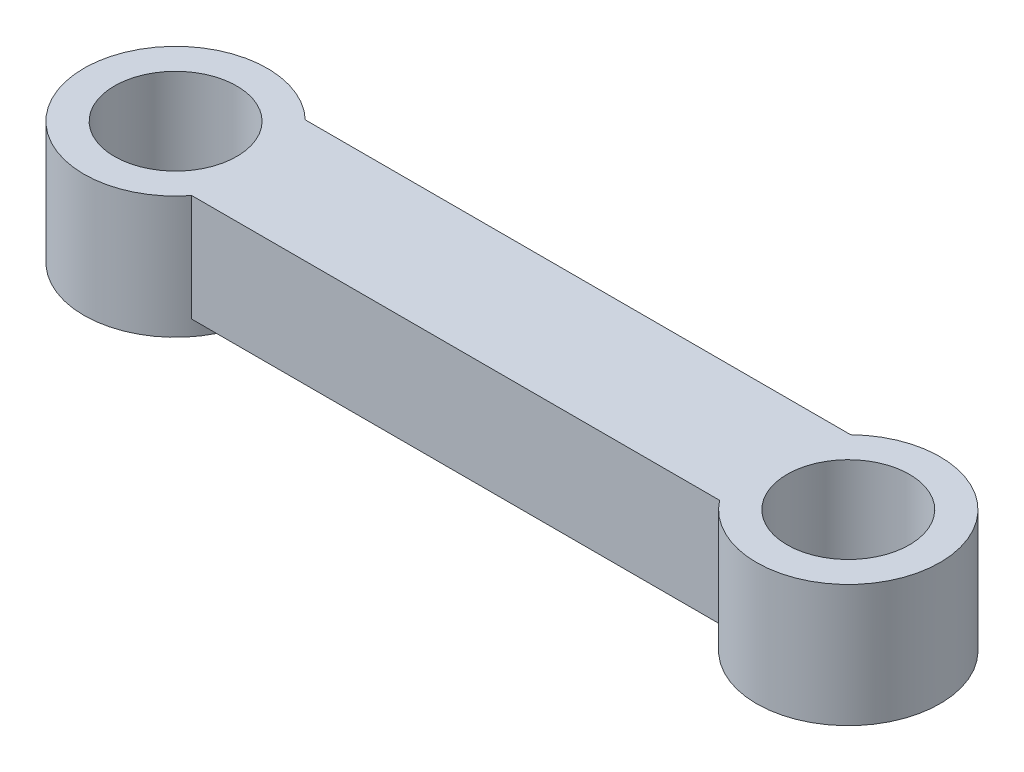
ISO-10303-21;
HEADER;
FILE_DESCRIPTION(('STEP AP214'),'2;1');
FILE_NAME('part.step','',(''),(''),'','','');
FILE_SCHEMA(('AUTOMOTIVE_DESIGN { 1 0 10303 214 1 1 1 1 }'));
ENDSEC;
DATA;
#1=APPLICATION_CONTEXT('core data for automotive mechanical design processes');
#2=APPLICATION_PROTOCOL_DEFINITION('international standard','automotive_design',2000,#1);
#3=PRODUCT_CONTEXT('',#1,'mechanical');
#4=PRODUCT('Part','Part','',(#3));
#5=PRODUCT_RELATED_PRODUCT_CATEGORY('part','',(#4));
#6=PRODUCT_DEFINITION_FORMATION('','',#4);
#7=PRODUCT_DEFINITION_CONTEXT('part definition',#1,'design');
#8=PRODUCT_DEFINITION('design','',#6,#7);
#9=PRODUCT_DEFINITION_SHAPE('','',#8);
#10=(LENGTH_UNIT() NAMED_UNIT(*) SI_UNIT(.MILLI.,.METRE.));
#11=(NAMED_UNIT(*) PLANE_ANGLE_UNIT() SI_UNIT($,.RADIAN.));
#12=(NAMED_UNIT(*) SI_UNIT($,.STERADIAN.) SOLID_ANGLE_UNIT());
#13=UNCERTAINTY_MEASURE_WITH_UNIT(LENGTH_MEASURE(1.E-05),#10,'distance_accuracy_value','');
#14=(GEOMETRIC_REPRESENTATION_CONTEXT(3) GLOBAL_UNCERTAINTY_ASSIGNED_CONTEXT((#13)) GLOBAL_UNIT_ASSIGNED_CONTEXT((#10,
#11,#12)) REPRESENTATION_CONTEXT('',''));
#15=CARTESIAN_POINT('',(0.,0.,0.));
#16=DIRECTION('',(0.,0.,1.));
#17=DIRECTION('',(1.,0.,0.));
#18=AXIS2_PLACEMENT_3D('',#15,#16,#17);
#19=CARTESIAN_POINT('',(0.,3.5,0.));
#20=DIRECTION('',(0.,0.,-1.));
#21=DIRECTION('',(-1.,0.,0.));
#22=AXIS2_PLACEMENT_3D('',#19,#20,#21);
#23=PLANE('',#22);
#24=DIRECTION('',(1.,0.,0.));
#25=VECTOR('',#24,1.);
#26=CARTESIAN_POINT('',(0.,0.,0.));
#27=LINE('',#26,#25);
#28=CARTESIAN_POINT('',(5.36894795532949,0.,0.));
#29=VERTEX_POINT('',#28);
#30=CARTESIAN_POINT('',(22.6310520446705,0.,0.));
#31=VERTEX_POINT('',#30);
#32=EDGE_CURVE('E98',#29,#31,#27,.T.);
#33=ORIENTED_EDGE('',*,*,#32,.T.);
#34=DIRECTION('',(0.,1.,0.));
#35=VECTOR('',#34,1.);
#36=CARTESIAN_POINT('',(22.6310520446705,-0.5,0.));
#37=LINE('',#36,#35);
#38=CARTESIAN_POINT('',(22.6310520446705,3.5,0.));
#39=VERTEX_POINT('',#38);
#40=EDGE_CURVE('E113',#31,#39,#37,.T.);
#41=ORIENTED_EDGE('',*,*,#40,.T.);
#42=DIRECTION('',(1.,0.,0.));
#43=VECTOR('',#42,1.);
#44=CARTESIAN_POINT('',(0.,3.5,0.));
#45=LINE('',#44,#43);
#46=CARTESIAN_POINT('',(5.36894795532949,3.5,0.));
#47=VERTEX_POINT('',#46);
#48=EDGE_CURVE('E55',#47,#39,#45,.T.);
#49=ORIENTED_EDGE('',*,*,#48,.F.);
#50=DIRECTION('',(0.,1.,0.));
#51=VECTOR('',#50,1.);
#52=CARTESIAN_POINT('',(5.36894795532949,-0.5,0.));
#53=LINE('',#52,#51);
#54=EDGE_CURVE('E100',#47,#29,#53,.F.);
#55=ORIENTED_EDGE('',*,*,#54,.T.);
#56=EDGE_LOOP('',(#33,#41,#49,#55));
#57=FACE_BOUND('',#56,.T.);
#58=ADVANCED_FACE('F33',(#57),#23,.F.);
#59=CARTESIAN_POINT('',(0.,3.5,-4.));
#60=DIRECTION('',(0.,0.,1.));
#61=DIRECTION('',(1.,0.,0.));
#62=AXIS2_PLACEMENT_3D('',#59,#60,#61);
#63=PLANE('',#62);
#64=DIRECTION('',(-1.,0.,0.));
#65=VECTOR('',#64,1.);
#66=CARTESIAN_POINT('',(0.,3.5,-4.));
#67=LINE('',#66,#65);
#68=CARTESIAN_POINT('',(22.9173774059633,3.5,-4.));
#69=VERTEX_POINT('',#68);
#70=CARTESIAN_POINT('',(5.08262259403675,3.5,-4.));
#71=VERTEX_POINT('',#70);
#72=EDGE_CURVE('E40',#69,#71,#67,.T.);
#73=ORIENTED_EDGE('',*,*,#72,.F.);
#74=DIRECTION('',(0.,1.,0.));
#75=VECTOR('',#74,1.);
#76=CARTESIAN_POINT('',(22.9173774059633,-0.5,-4.));
#77=LINE('',#76,#75);
#78=CARTESIAN_POINT('',(22.9173774059633,0.,-4.));
#79=VERTEX_POINT('',#78);
#80=EDGE_CURVE('E74',#69,#79,#77,.F.);
#81=ORIENTED_EDGE('',*,*,#80,.T.);
#82=DIRECTION('',(-1.,0.,0.));
#83=VECTOR('',#82,1.);
#84=CARTESIAN_POINT('',(0.,0.,-4.));
#85=LINE('',#84,#83);
#86=CARTESIAN_POINT('',(5.08262259403675,0.,-4.));
#87=VERTEX_POINT('',#86);
#88=EDGE_CURVE('E94',#79,#87,#85,.T.);
#89=ORIENTED_EDGE('',*,*,#88,.T.);
#90=DIRECTION('',(0.,1.,0.));
#91=VECTOR('',#90,1.);
#92=CARTESIAN_POINT('',(5.08262259403675,-0.5,-4.));
#93=LINE('',#92,#91);
#94=EDGE_CURVE('E92',#87,#71,#93,.T.);
#95=ORIENTED_EDGE('',*,*,#94,.T.);
#96=EDGE_LOOP('',(#73,#81,#89,#95));
#97=FACE_BOUND('',#96,.T.);
#98=ADVANCED_FACE('F91',(#97),#63,.F.);
#99=CARTESIAN_POINT('',(0.,0.,0.));
#100=DIRECTION('',(0.,-1.,0.));
#101=DIRECTION('',(0.,0.,-1.));
#102=AXIS2_PLACEMENT_3D('',#99,#100,#101);
#103=PLANE('',#102);
#104=CARTESIAN_POINT('',(25.,0.,-1.84067530676657));
#105=DIRECTION('',(0.,-1.,0.));
#106=DIRECTION('',(0.,0.,-1.));
#107=AXIS2_PLACEMENT_3D('',#104,#105,#106);
#108=CIRCLE('',#107,3.);
#109=EDGE_CURVE('E80',#31,#79,#108,.T.);
#110=ORIENTED_EDGE('',*,*,#109,.F.);
#111=ORIENTED_EDGE('',*,*,#32,.F.);
#112=CARTESIAN_POINT('',(3.,0.,-1.84067530676657));
#113=DIRECTION('',(0.,-1.,0.));
#114=DIRECTION('',(0.,0.,-1.));
#115=AXIS2_PLACEMENT_3D('',#112,#113,#114);
#116=CIRCLE('',#115,3.);
#117=EDGE_CURVE('E11',#87,#29,#116,.T.);
#118=ORIENTED_EDGE('',*,*,#117,.F.);
#119=ORIENTED_EDGE('',*,*,#88,.F.);
#120=EDGE_LOOP('',(#110,#111,#118,#119));
#121=FACE_BOUND('',#120,.T.);
#122=ADVANCED_FACE('F104',(#121),#103,.T.);
#123=CARTESIAN_POINT('',(0.,3.5,0.));
#124=DIRECTION('',(0.,-1.,0.));
#125=DIRECTION('',(0.,0.,-1.));
#126=AXIS2_PLACEMENT_3D('',#123,#124,#125);
#127=PLANE('',#126);
#128=CARTESIAN_POINT('',(3.,3.5,-1.84067530676657));
#129=DIRECTION('',(0.,1.,0.));
#130=DIRECTION('',(0.,0.,1.));
#131=AXIS2_PLACEMENT_3D('',#128,#129,#130);
#132=CIRCLE('',#131,2.);
#133=CARTESIAN_POINT('',(3.,3.5,0.15932469323343));
#134=VERTEX_POINT('',#133);
#135=EDGE_CURVE('E124',#134,#134,#132,.T.);
#136=ORIENTED_EDGE('',*,*,#135,.F.);
#137=EDGE_LOOP('',(#136));
#138=FACE_BOUND('',#137,.T.);
#139=CARTESIAN_POINT('',(25.,3.5,-1.84067530676657));
#140=DIRECTION('',(0.,1.,0.));
#141=DIRECTION('',(0.,0.,1.));
#142=AXIS2_PLACEMENT_3D('',#139,#140,#141);
#143=CIRCLE('',#142,2.);
#144=CARTESIAN_POINT('',(25.,3.5,0.159324693233433));
#145=VERTEX_POINT('',#144);
#146=EDGE_CURVE('E118',#145,#145,#143,.T.);
#147=ORIENTED_EDGE('',*,*,#146,.F.);
#148=EDGE_LOOP('',(#147));
#149=FACE_BOUND('',#148,.T.);
#150=ORIENTED_EDGE('',*,*,#48,.T.);
#151=CARTESIAN_POINT('',(25.,3.5,-1.84067530676657));
#152=DIRECTION('',(0.,1.,0.));
#153=DIRECTION('',(0.,0.,1.));
#154=AXIS2_PLACEMENT_3D('',#151,#152,#153);
#155=CIRCLE('',#154,3.);
#156=EDGE_CURVE('E78',#39,#69,#155,.T.);
#157=ORIENTED_EDGE('',*,*,#156,.T.);
#158=ORIENTED_EDGE('',*,*,#72,.T.);
#159=CARTESIAN_POINT('',(3.,3.5,-1.84067530676657));
#160=DIRECTION('',(0.,1.,0.));
#161=DIRECTION('',(0.,0.,1.));
#162=AXIS2_PLACEMENT_3D('',#159,#160,#161);
#163=CIRCLE('',#162,3.);
#164=EDGE_CURVE('E47',#71,#47,#163,.T.);
#165=ORIENTED_EDGE('',*,*,#164,.T.);
#166=EDGE_LOOP('',(#150,#157,#158,#165));
#167=FACE_BOUND('',#166,.T.);
#168=ADVANCED_FACE('F86',(#138,#149,#167),#127,.F.);
#169=CARTESIAN_POINT('',(3.,-0.5,-1.84067530676657));
#170=DIRECTION('',(0.,1.,0.));
#171=DIRECTION('',(0.,0.,1.));
#172=AXIS2_PLACEMENT_3D('',#169,#170,#171);
#173=CYLINDRICAL_SURFACE('',#172,3.);
#174=ORIENTED_EDGE('',*,*,#164,.F.);
#175=ORIENTED_EDGE('',*,*,#94,.F.);
#176=ORIENTED_EDGE('',*,*,#117,.T.);
#177=ORIENTED_EDGE('',*,*,#54,.F.);
#178=EDGE_LOOP('',(#174,#175,#176,#177));
#179=FACE_BOUND('',#178,.T.);
#180=CARTESIAN_POINT('',(3.,-0.5,-1.84067530676657));
#181=DIRECTION('',(0.,1.,0.));
#182=DIRECTION('',(0.,0.,1.));
#183=AXIS2_PLACEMENT_3D('',#180,#181,#182);
#184=CIRCLE('',#183,3.);
#185=CARTESIAN_POINT('',(3.,-0.5,1.15932469323343));
#186=VERTEX_POINT('',#185);
#187=EDGE_CURVE('E107',#186,#186,#184,.T.);
#188=ORIENTED_EDGE('',*,*,#187,.T.);
#189=EDGE_LOOP('',(#188));
#190=FACE_BOUND('',#189,.T.);
#191=ADVANCED_FACE('F105',(#179,#190),#173,.T.);
#192=CARTESIAN_POINT('',(3.,-0.5,-1.84067530676657));
#193=DIRECTION('',(0.,1.,0.));
#194=DIRECTION('',(0.,0.,1.));
#195=AXIS2_PLACEMENT_3D('',#192,#193,#194);
#196=PLANE('',#195);
#197=CARTESIAN_POINT('',(3.,-0.5,-1.84067530676657));
#198=DIRECTION('',(0.,1.,0.));
#199=DIRECTION('',(0.,0.,1.));
#200=AXIS2_PLACEMENT_3D('',#197,#198,#199);
#201=CIRCLE('',#200,2.);
#202=CARTESIAN_POINT('',(3.,-0.5,0.15932469323343));
#203=VERTEX_POINT('',#202);
#204=EDGE_CURVE('E89',#203,#203,#201,.T.);
#205=ORIENTED_EDGE('',*,*,#204,.T.);
#206=EDGE_LOOP('',(#205));
#207=FACE_BOUND('',#206,.T.);
#208=ORIENTED_EDGE('',*,*,#187,.F.);
#209=EDGE_LOOP('',(#208));
#210=FACE_BOUND('',#209,.T.);
#211=ADVANCED_FACE('F130',(#207,#210),#196,.F.);
#212=CARTESIAN_POINT('',(25.,-0.5,-1.84067530676657));
#213=DIRECTION('',(0.,1.,0.));
#214=DIRECTION('',(0.,0.,1.));
#215=AXIS2_PLACEMENT_3D('',#212,#213,#214);
#216=CYLINDRICAL_SURFACE('',#215,3.);
#217=ORIENTED_EDGE('',*,*,#156,.F.);
#218=ORIENTED_EDGE('',*,*,#40,.F.);
#219=ORIENTED_EDGE('',*,*,#109,.T.);
#220=ORIENTED_EDGE('',*,*,#80,.F.);
#221=EDGE_LOOP('',(#217,#218,#219,#220));
#222=FACE_BOUND('',#221,.T.);
#223=CARTESIAN_POINT('',(25.,-0.5,-1.84067530676657));
#224=DIRECTION('',(0.,1.,0.));
#225=DIRECTION('',(0.,0.,1.));
#226=AXIS2_PLACEMENT_3D('',#223,#224,#225);
#227=CIRCLE('',#226,3.);
#228=CARTESIAN_POINT('',(25.,-0.5,1.15932469323343));
#229=VERTEX_POINT('',#228);
#230=EDGE_CURVE('E88',#229,#229,#227,.T.);
#231=ORIENTED_EDGE('',*,*,#230,.T.);
#232=EDGE_LOOP('',(#231));
#233=FACE_BOUND('',#232,.T.);
#234=ADVANCED_FACE('F76',(#222,#233),#216,.T.);
#235=CARTESIAN_POINT('',(25.,-0.5,-1.84067530676657));
#236=DIRECTION('',(0.,1.,0.));
#237=DIRECTION('',(0.,0.,1.));
#238=AXIS2_PLACEMENT_3D('',#235,#236,#237);
#239=PLANE('',#238);
#240=CARTESIAN_POINT('',(25.,-0.5,-1.84067530676657));
#241=DIRECTION('',(0.,1.,0.));
#242=DIRECTION('',(0.,0.,1.));
#243=AXIS2_PLACEMENT_3D('',#240,#241,#242);
#244=CIRCLE('',#243,2.);
#245=CARTESIAN_POINT('',(25.,-0.5,0.159324693233433));
#246=VERTEX_POINT('',#245);
#247=EDGE_CURVE('E121',#246,#246,#244,.T.);
#248=ORIENTED_EDGE('',*,*,#247,.T.);
#249=EDGE_LOOP('',(#248));
#250=FACE_BOUND('',#249,.T.);
#251=ORIENTED_EDGE('',*,*,#230,.F.);
#252=EDGE_LOOP('',(#251));
#253=FACE_BOUND('',#252,.T.);
#254=ADVANCED_FACE('F146',(#250,#253),#239,.F.);
#255=CARTESIAN_POINT('',(25.,-0.5,-1.84067530676657));
#256=DIRECTION('',(0.,1.,0.));
#257=DIRECTION('',(0.,0.,1.));
#258=AXIS2_PLACEMENT_3D('',#255,#256,#257);
#259=CYLINDRICAL_SURFACE('',#258,2.);
#260=ORIENTED_EDGE('',*,*,#247,.F.);
#261=EDGE_LOOP('',(#260));
#262=FACE_BOUND('',#261,.T.);
#263=ORIENTED_EDGE('',*,*,#146,.T.);
#264=EDGE_LOOP('',(#263));
#265=FACE_BOUND('',#264,.T.);
#266=ADVANCED_FACE('F136',(#262,#265),#259,.F.);
#267=CARTESIAN_POINT('',(3.,-0.5,-1.84067530676657));
#268=DIRECTION('',(0.,1.,0.));
#269=DIRECTION('',(0.,0.,1.));
#270=AXIS2_PLACEMENT_3D('',#267,#268,#269);
#271=CYLINDRICAL_SURFACE('',#270,2.);
#272=ORIENTED_EDGE('',*,*,#204,.F.);
#273=EDGE_LOOP('',(#272));
#274=FACE_BOUND('',#273,.T.);
#275=ORIENTED_EDGE('',*,*,#135,.T.);
#276=EDGE_LOOP('',(#275));
#277=FACE_BOUND('',#276,.T.);
#278=ADVANCED_FACE('F133',(#274,#277),#271,.F.);
#279=CLOSED_SHELL('',(#58,#98,#122,#168,#191,#211,#234,#254,#266,#278));
#280=MANIFOLD_SOLID_BREP('B2',#279);
#281=ADVANCED_BREP_SHAPE_REPRESENTATION('',(#18,#280),#14);
#282=SHAPE_DEFINITION_REPRESENTATION(#9,#281);
ENDSEC;
END-ISO-10303-21;
